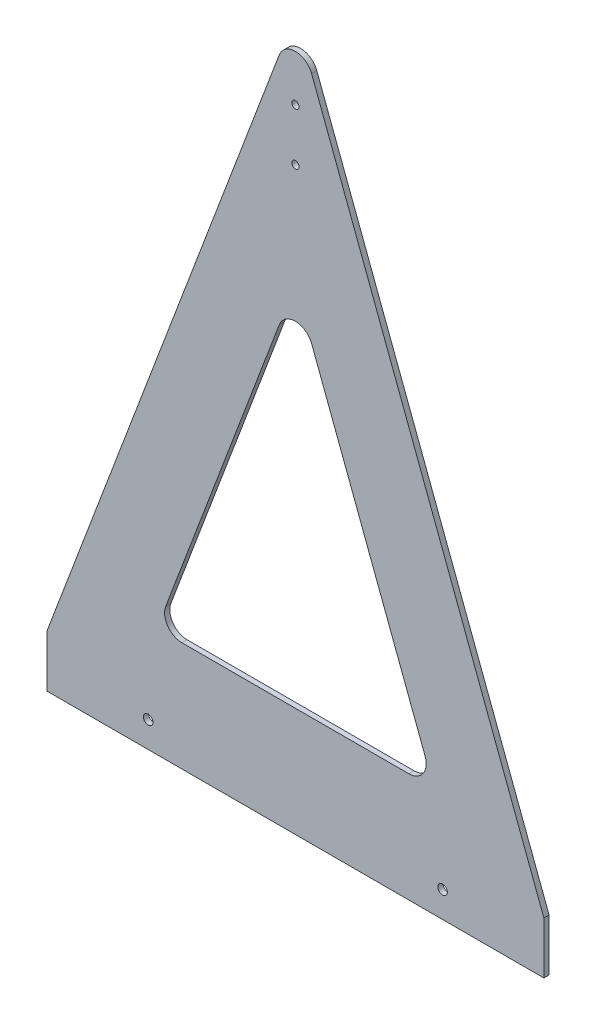
ISO-10303-21;
HEADER;
FILE_DESCRIPTION(('STEP AP214'),'2;1');
FILE_NAME('part.step','',(''),(''),'','','');
FILE_SCHEMA(('AUTOMOTIVE_DESIGN { 1 0 10303 214 1 1 1 1 }'));
ENDSEC;
DATA;
#1=APPLICATION_CONTEXT('core data for automotive mechanical design processes');
#2=APPLICATION_PROTOCOL_DEFINITION('international standard','automotive_design',2000,#1);
#3=PRODUCT_CONTEXT('',#1,'mechanical');
#4=PRODUCT('Part','Part','',(#3));
#5=PRODUCT_RELATED_PRODUCT_CATEGORY('part','',(#4));
#6=PRODUCT_DEFINITION_FORMATION('','',#4);
#7=PRODUCT_DEFINITION_CONTEXT('part definition',#1,'design');
#8=PRODUCT_DEFINITION('design','',#6,#7);
#9=PRODUCT_DEFINITION_SHAPE('','',#8);
#10=(LENGTH_UNIT() NAMED_UNIT(*) SI_UNIT(.MILLI.,.METRE.));
#11=(NAMED_UNIT(*) PLANE_ANGLE_UNIT() SI_UNIT($,.RADIAN.));
#12=(NAMED_UNIT(*) SI_UNIT($,.STERADIAN.) SOLID_ANGLE_UNIT());
#13=UNCERTAINTY_MEASURE_WITH_UNIT(LENGTH_MEASURE(1.E-05),#10,'distance_accuracy_value','');
#14=(GEOMETRIC_REPRESENTATION_CONTEXT(3) GLOBAL_UNCERTAINTY_ASSIGNED_CONTEXT((#13)) GLOBAL_UNIT_ASSIGNED_CONTEXT((#10,
#11,#12)) REPRESENTATION_CONTEXT('',''));
#15=CARTESIAN_POINT('',(0.,0.,0.));
#16=DIRECTION('',(0.,0.,1.));
#17=DIRECTION('',(1.,0.,0.));
#18=AXIS2_PLACEMENT_3D('',#15,#16,#17);
#19=CARTESIAN_POINT('',(0.,381.693910764514,3.));
#20=DIRECTION('',(0.,0.,1.));
#21=DIRECTION('',(1.,0.,0.));
#22=AXIS2_PLACEMENT_3D('',#19,#20,#21);
#23=PLANE('',#22);
#24=CARTESIAN_POINT('',(-65.5344110387045,73.1533101045285,3.));
#25=DIRECTION('',(0.,0.,-1.));
#26=DIRECTION('',(1.,0.,0.));
#27=AXIS2_PLACEMENT_3D('',#24,#25,#26);
#28=CIRCLE('',#27,10.);
#29=CARTESIAN_POINT('',(-65.5344110387045,63.1533101045285,3.));
#30=VERTEX_POINT('',#29);
#31=CARTESIAN_POINT('',(-74.8895840605347,76.686118864088,3.));
#32=VERTEX_POINT('',#31);
#33=EDGE_CURVE('E124',#30,#32,#28,.T.);
#34=ORIENTED_EDGE('',*,*,#33,.T.);
#35=DIRECTION('',(0.353280875955955,0.935517302183018,0.));
#36=VECTOR('',#35,1.);
#37=CARTESIAN_POINT('',(-9.35517302183021,250.226719524072,3.));
#38=LINE('',#37,#36);
#39=CARTESIAN_POINT('',(-9.35517302183022,250.226719524072,3.));
#40=VERTEX_POINT('',#39);
#41=EDGE_CURVE('E133',#32,#40,#38,.T.);
#42=ORIENTED_EDGE('',*,*,#41,.T.);
#43=CARTESIAN_POINT('',(0.,246.693910764513,3.));
#44=DIRECTION('',(0.,0.,-1.));
#45=DIRECTION('',(-1.,0.,0.));
#46=AXIS2_PLACEMENT_3D('',#43,#44,#45);
#47=CIRCLE('',#46,10.);
#48=CARTESIAN_POINT('',(9.35517302183021,250.226719524072,3.));
#49=VERTEX_POINT('',#48);
#50=EDGE_CURVE('E48',#40,#49,#47,.T.);
#51=ORIENTED_EDGE('',*,*,#50,.T.);
#52=DIRECTION('',(0.353280875955955,-0.935517302183018,0.));
#53=VECTOR('',#52,1.);
#54=CARTESIAN_POINT('',(9.35517302183021,250.226719524072,3.));
#55=LINE('',#54,#53);
#56=CARTESIAN_POINT('',(74.8895840605347,76.686118864088,3.));
#57=VERTEX_POINT('',#56);
#58=EDGE_CURVE('E147',#49,#57,#55,.T.);
#59=ORIENTED_EDGE('',*,*,#58,.T.);
#60=CARTESIAN_POINT('',(65.5344110387045,73.1533101045285,3.));
#61=DIRECTION('',(0.,0.,-1.));
#62=DIRECTION('',(-1.,0.,0.));
#63=AXIS2_PLACEMENT_3D('',#60,#61,#62);
#64=CIRCLE('',#63,10.);
#65=CARTESIAN_POINT('',(65.5344110387045,63.1533101045285,3.));
#66=VERTEX_POINT('',#65);
#67=EDGE_CURVE('E150',#57,#66,#64,.T.);
#68=ORIENTED_EDGE('',*,*,#67,.T.);
#69=DIRECTION('',(-1.,0.,0.));
#70=VECTOR('',#69,1.);
#71=CARTESIAN_POINT('',(-65.5344110387045,63.1533101045285,3.));
#72=LINE('',#71,#70);
#73=EDGE_CURVE('E130',#66,#30,#72,.T.);
#74=ORIENTED_EDGE('',*,*,#73,.T.);
#75=EDGE_LOOP('',(#34,#42,#51,#59,#68,#74));
#76=FACE_BOUND('',#75,.T.);
#77=CARTESIAN_POINT('',(85.,15.,3.));
#78=DIRECTION('',(0.,0.,-1.));
#79=DIRECTION('',(-1.,0.,0.));
#80=AXIS2_PLACEMENT_3D('',#77,#78,#79);
#81=CIRCLE('',#80,2.75);
#82=CARTESIAN_POINT('',(82.25,15.,3.));
#83=VERTEX_POINT('',#82);
#84=EDGE_CURVE('E176',#83,#83,#81,.T.);
#85=ORIENTED_EDGE('',*,*,#84,.T.);
#86=EDGE_LOOP('',(#85));
#87=FACE_BOUND('',#86,.T.);
#88=CARTESIAN_POINT('',(-85.,15.,3.));
#89=DIRECTION('',(0.,0.,-1.));
#90=DIRECTION('',(-1.,0.,0.));
#91=AXIS2_PLACEMENT_3D('',#88,#89,#90);
#92=CIRCLE('',#91,2.75);
#93=CARTESIAN_POINT('',(-87.75,15.,3.));
#94=VERTEX_POINT('',#93);
#95=EDGE_CURVE('E182',#94,#94,#92,.T.);
#96=ORIENTED_EDGE('',*,*,#95,.T.);
#97=EDGE_LOOP('',(#96));
#98=FACE_BOUND('',#97,.T.);
#99=CARTESIAN_POINT('',(-1.0548853457415E-11,364.999999999999,3.));
#100=DIRECTION('',(0.,0.,1.));
#101=DIRECTION('',(1.,0.,0.));
#102=AXIS2_PLACEMENT_3D('',#99,#100,#101);
#103=CIRCLE('',#102,2.1);
#104=CARTESIAN_POINT('',(2.09999999998945,364.999999999999,3.));
#105=VERTEX_POINT('',#104);
#106=EDGE_CURVE('E192',#105,#105,#103,.T.);
#107=ORIENTED_EDGE('',*,*,#106,.F.);
#108=EDGE_LOOP('',(#107));
#109=FACE_BOUND('',#108,.T.);
#110=DIRECTION('',(0.,1.,0.));
#111=VECTOR('',#110,1.);
#112=CARTESIAN_POINT('',(143.5,0.,3.));
#113=LINE('',#112,#111);
#114=CARTESIAN_POINT('',(143.5,0.,3.));
#115=VERTEX_POINT('',#114);
#116=CARTESIAN_POINT('',(143.5,30.,3.));
#117=VERTEX_POINT('',#116);
#118=EDGE_CURVE('E198',#115,#117,#113,.T.);
#119=ORIENTED_EDGE('',*,*,#118,.T.);
#120=DIRECTION('',(-0.353280875955956,0.935517302183018,0.));
#121=VECTOR('',#120,1.);
#122=CARTESIAN_POINT('',(143.5,30.,3.));
#123=LINE('',#122,#121);
#124=CARTESIAN_POINT('',(9.35517302183029,385.226719524073,3.));
#125=VERTEX_POINT('',#124);
#126=EDGE_CURVE('E201',#117,#125,#123,.T.);
#127=ORIENTED_EDGE('',*,*,#126,.T.);
#128=CARTESIAN_POINT('',(0.,381.693910764514,3.));
#129=DIRECTION('',(0.,0.,1.));
#130=DIRECTION('',(1.,0.,0.));
#131=AXIS2_PLACEMENT_3D('',#128,#129,#130);
#132=CIRCLE('',#131,10.);
#133=CARTESIAN_POINT('',(-9.35517302183028,385.226719524073,3.));
#134=VERTEX_POINT('',#133);
#135=EDGE_CURVE('E204',#125,#134,#132,.T.);
#136=ORIENTED_EDGE('',*,*,#135,.T.);
#137=DIRECTION('',(-0.353280875955955,-0.935517302183018,0.));
#138=VECTOR('',#137,1.);
#139=CARTESIAN_POINT('',(-143.5,29.9999999999991,3.));
#140=LINE('',#139,#138);
#141=CARTESIAN_POINT('',(-143.5,29.9999999999991,3.));
#142=VERTEX_POINT('',#141);
#143=EDGE_CURVE('E206',#134,#142,#140,.T.);
#144=ORIENTED_EDGE('',*,*,#143,.T.);
#145=DIRECTION('',(0.,-1.,0.));
#146=VECTOR('',#145,1.);
#147=CARTESIAN_POINT('',(-143.5,-8.88178419700125E-13,3.));
#148=LINE('',#147,#146);
#149=CARTESIAN_POINT('',(-143.5,-8.88178419700125E-13,3.));
#150=VERTEX_POINT('',#149);
#151=EDGE_CURVE('E208',#142,#150,#148,.T.);
#152=ORIENTED_EDGE('',*,*,#151,.T.);
#153=DIRECTION('',(1.,0.,0.));
#154=VECTOR('',#153,1.);
#155=CARTESIAN_POINT('',(-143.5,-8.88178419700125E-13,3.));
#156=LINE('',#155,#154);
#157=EDGE_CURVE('E210',#150,#115,#156,.T.);
#158=ORIENTED_EDGE('',*,*,#157,.T.);
#159=EDGE_LOOP('',(#119,#127,#136,#144,#152,#158));
#160=FACE_BOUND('',#159,.T.);
#161=CARTESIAN_POINT('',(-9.42486254559352E-12,335.,3.));
#162=DIRECTION('',(0.,0.,1.));
#163=DIRECTION('',(1.,0.,0.));
#164=AXIS2_PLACEMENT_3D('',#161,#162,#163);
#165=CIRCLE('',#164,2.1);
#166=CARTESIAN_POINT('',(2.09999999999057,335.,3.));
#167=VERTEX_POINT('',#166);
#168=EDGE_CURVE('E186',#167,#167,#165,.T.);
#169=ORIENTED_EDGE('',*,*,#168,.F.);
#170=EDGE_LOOP('',(#169));
#171=FACE_BOUND('',#170,.T.);
#172=ADVANCED_FACE('F33',(#76,#87,#98,#109,#160,#171),#23,.T.);
#173=CARTESIAN_POINT('',(0.,381.693910764514,0.));
#174=DIRECTION('',(0.,0.,1.));
#175=DIRECTION('',(1.,0.,0.));
#176=AXIS2_PLACEMENT_3D('',#173,#174,#175);
#177=PLANE('',#176);
#178=DIRECTION('',(0.353280875955955,0.935517302183018,0.));
#179=VECTOR('',#178,1.);
#180=CARTESIAN_POINT('',(-9.35517302183021,250.226719524072,0.));
#181=LINE('',#180,#179);
#182=CARTESIAN_POINT('',(-74.8895840605347,76.686118864088,0.));
#183=VERTEX_POINT('',#182);
#184=CARTESIAN_POINT('',(-9.35517302183021,250.226719524072,0.));
#185=VERTEX_POINT('',#184);
#186=EDGE_CURVE('E154',#183,#185,#181,.T.);
#187=ORIENTED_EDGE('',*,*,#186,.F.);
#188=CARTESIAN_POINT('',(-65.5344110387045,73.1533101045285,0.));
#189=DIRECTION('',(0.,0.,-1.));
#190=DIRECTION('',(1.,0.,0.));
#191=AXIS2_PLACEMENT_3D('',#188,#189,#190);
#192=CIRCLE('',#191,10.);
#193=CARTESIAN_POINT('',(-65.5344110387045,63.1533101045285,0.));
#194=VERTEX_POINT('',#193);
#195=EDGE_CURVE('E56',#194,#183,#192,.T.);
#196=ORIENTED_EDGE('',*,*,#195,.F.);
#197=DIRECTION('',(-1.,0.,0.));
#198=VECTOR('',#197,1.);
#199=CARTESIAN_POINT('',(-65.5344110387045,63.1533101045285,0.));
#200=LINE('',#199,#198);
#201=CARTESIAN_POINT('',(65.5344110387045,63.1533101045285,0.));
#202=VERTEX_POINT('',#201);
#203=EDGE_CURVE('E140',#202,#194,#200,.T.);
#204=ORIENTED_EDGE('',*,*,#203,.F.);
#205=CARTESIAN_POINT('',(65.5344110387045,73.1533101045285,0.));
#206=DIRECTION('',(0.,0.,-1.));
#207=DIRECTION('',(-1.,0.,0.));
#208=AXIS2_PLACEMENT_3D('',#205,#206,#207);
#209=CIRCLE('',#208,10.);
#210=CARTESIAN_POINT('',(74.8895840605347,76.686118864088,0.));
#211=VERTEX_POINT('',#210);
#212=EDGE_CURVE('E143',#211,#202,#209,.T.);
#213=ORIENTED_EDGE('',*,*,#212,.F.);
#214=DIRECTION('',(0.353280875955955,-0.935517302183018,0.));
#215=VECTOR('',#214,1.);
#216=CARTESIAN_POINT('',(9.35517302183021,250.226719524072,0.));
#217=LINE('',#216,#215);
#218=CARTESIAN_POINT('',(9.35517302183021,250.226719524072,0.));
#219=VERTEX_POINT('',#218);
#220=EDGE_CURVE('E159',#219,#211,#217,.T.);
#221=ORIENTED_EDGE('',*,*,#220,.F.);
#222=CARTESIAN_POINT('',(0.,246.693910764513,0.));
#223=DIRECTION('',(0.,0.,-1.));
#224=DIRECTION('',(-1.,0.,0.));
#225=AXIS2_PLACEMENT_3D('',#222,#223,#224);
#226=CIRCLE('',#225,10.);
#227=EDGE_CURVE('E156',#185,#219,#226,.T.);
#228=ORIENTED_EDGE('',*,*,#227,.F.);
#229=EDGE_LOOP('',(#187,#196,#204,#213,#221,#228));
#230=FACE_BOUND('',#229,.T.);
#231=CARTESIAN_POINT('',(85.,15.,0.));
#232=DIRECTION('',(0.,0.,-1.));
#233=DIRECTION('',(-1.,0.,0.));
#234=AXIS2_PLACEMENT_3D('',#231,#232,#233);
#235=CIRCLE('',#234,2.75);
#236=CARTESIAN_POINT('',(82.25,15.,0.));
#237=VERTEX_POINT('',#236);
#238=EDGE_CURVE('E166',#237,#237,#235,.T.);
#239=ORIENTED_EDGE('',*,*,#238,.F.);
#240=EDGE_LOOP('',(#239));
#241=FACE_BOUND('',#240,.T.);
#242=CARTESIAN_POINT('',(-85.,15.,0.));
#243=DIRECTION('',(0.,0.,-1.));
#244=DIRECTION('',(-1.,0.,0.));
#245=AXIS2_PLACEMENT_3D('',#242,#243,#244);
#246=CIRCLE('',#245,2.75);
#247=CARTESIAN_POINT('',(-87.75,15.,0.));
#248=VERTEX_POINT('',#247);
#249=EDGE_CURVE('E179',#248,#248,#246,.T.);
#250=ORIENTED_EDGE('',*,*,#249,.F.);
#251=EDGE_LOOP('',(#250));
#252=FACE_BOUND('',#251,.T.);
#253=DIRECTION('',(0.,1.,0.));
#254=VECTOR('',#253,1.);
#255=CARTESIAN_POINT('',(143.5,0.,0.));
#256=LINE('',#255,#254);
#257=CARTESIAN_POINT('',(143.5,0.,0.));
#258=VERTEX_POINT('',#257);
#259=CARTESIAN_POINT('',(143.5,30.,0.));
#260=VERTEX_POINT('',#259);
#261=EDGE_CURVE('E195',#258,#260,#256,.T.);
#262=ORIENTED_EDGE('',*,*,#261,.F.);
#263=DIRECTION('',(1.,0.,0.));
#264=VECTOR('',#263,1.);
#265=CARTESIAN_POINT('',(-143.5,-8.88178419700125E-13,0.));
#266=LINE('',#265,#264);
#267=CARTESIAN_POINT('',(-143.5,-8.88178419700125E-13,0.));
#268=VERTEX_POINT('',#267);
#269=EDGE_CURVE('E202',#268,#258,#266,.T.);
#270=ORIENTED_EDGE('',*,*,#269,.F.);
#271=DIRECTION('',(0.,-1.,0.));
#272=VECTOR('',#271,1.);
#273=CARTESIAN_POINT('',(-143.5,-8.88178419700125E-13,0.));
#274=LINE('',#273,#272);
#275=CARTESIAN_POINT('',(-143.5,29.9999999999991,0.));
#276=VERTEX_POINT('',#275);
#277=EDGE_CURVE('E221',#276,#268,#274,.T.);
#278=ORIENTED_EDGE('',*,*,#277,.F.);
#279=DIRECTION('',(-0.353280875955955,-0.935517302183018,0.));
#280=VECTOR('',#279,1.);
#281=CARTESIAN_POINT('',(-143.5,29.9999999999991,0.));
#282=LINE('',#281,#280);
#283=CARTESIAN_POINT('',(-9.35517302183028,385.226719524073,0.));
#284=VERTEX_POINT('',#283);
#285=EDGE_CURVE('E219',#284,#276,#282,.T.);
#286=ORIENTED_EDGE('',*,*,#285,.F.);
#287=CARTESIAN_POINT('',(0.,381.693910764514,0.));
#288=DIRECTION('',(0.,0.,1.));
#289=DIRECTION('',(1.,0.,0.));
#290=AXIS2_PLACEMENT_3D('',#287,#288,#289);
#291=CIRCLE('',#290,10.);
#292=CARTESIAN_POINT('',(9.35517302183029,385.226719524073,0.));
#293=VERTEX_POINT('',#292);
#294=EDGE_CURVE('E217',#293,#284,#291,.T.);
#295=ORIENTED_EDGE('',*,*,#294,.F.);
#296=DIRECTION('',(-0.353280875955956,0.935517302183018,0.));
#297=VECTOR('',#296,1.);
#298=CARTESIAN_POINT('',(143.5,30.,0.));
#299=LINE('',#298,#297);
#300=EDGE_CURVE('E215',#260,#293,#299,.T.);
#301=ORIENTED_EDGE('',*,*,#300,.F.);
#302=EDGE_LOOP('',(#262,#270,#278,#286,#295,#301));
#303=FACE_BOUND('',#302,.T.);
#304=CARTESIAN_POINT('',(-1.0548853457415E-11,364.999999999999,0.));
#305=DIRECTION('',(0.,0.,1.));
#306=DIRECTION('',(1.,0.,0.));
#307=AXIS2_PLACEMENT_3D('',#304,#305,#306);
#308=CIRCLE('',#307,2.1);
#309=CARTESIAN_POINT('',(2.09999999998945,364.999999999999,0.));
#310=VERTEX_POINT('',#309);
#311=EDGE_CURVE('E189',#310,#310,#308,.T.);
#312=ORIENTED_EDGE('',*,*,#311,.T.);
#313=EDGE_LOOP('',(#312));
#314=FACE_BOUND('',#313,.T.);
#315=CARTESIAN_POINT('',(-9.42486254559352E-12,335.,0.));
#316=DIRECTION('',(0.,0.,1.));
#317=DIRECTION('',(1.,0.,0.));
#318=AXIS2_PLACEMENT_3D('',#315,#316,#317);
#319=CIRCLE('',#318,2.1);
#320=CARTESIAN_POINT('',(2.09999999999057,335.,0.));
#321=VERTEX_POINT('',#320);
#322=EDGE_CURVE('E185',#321,#321,#319,.T.);
#323=ORIENTED_EDGE('',*,*,#322,.T.);
#324=EDGE_LOOP('',(#323));
#325=FACE_BOUND('',#324,.T.);
#326=ADVANCED_FACE('F245',(#230,#241,#252,#303,#314,#325),#177,.F.);
#327=CARTESIAN_POINT('',(143.5,0.,3.));
#328=DIRECTION('',(-1.,0.,0.));
#329=DIRECTION('',(0.,0.,1.));
#330=AXIS2_PLACEMENT_3D('',#327,#328,#329);
#331=PLANE('',#330);
#332=ORIENTED_EDGE('',*,*,#261,.T.);
#333=DIRECTION('',(0.,0.,-1.));
#334=VECTOR('',#333,1.);
#335=CARTESIAN_POINT('',(143.5,30.,3.));
#336=LINE('',#335,#334);
#337=EDGE_CURVE('E11',#117,#260,#336,.T.);
#338=ORIENTED_EDGE('',*,*,#337,.F.);
#339=ORIENTED_EDGE('',*,*,#118,.F.);
#340=DIRECTION('',(0.,0.,-1.));
#341=VECTOR('',#340,1.);
#342=CARTESIAN_POINT('',(143.5,0.,3.));
#343=LINE('',#342,#341);
#344=EDGE_CURVE('E212',#115,#258,#343,.T.);
#345=ORIENTED_EDGE('',*,*,#344,.T.);
#346=EDGE_LOOP('',(#332,#338,#339,#345));
#347=FACE_BOUND('',#346,.T.);
#348=ADVANCED_FACE('F35',(#347),#331,.F.);
#349=CARTESIAN_POINT('',(143.5,30.,3.));
#350=DIRECTION('',(-0.935517302183018,-0.353280875955956,0.));
#351=DIRECTION('',(0.353280875955956,-0.935517302183018,0.));
#352=AXIS2_PLACEMENT_3D('',#349,#350,#351);
#353=PLANE('',#352);
#354=ORIENTED_EDGE('',*,*,#300,.T.);
#355=DIRECTION('',(0.,0.,-1.));
#356=VECTOR('',#355,1.);
#357=CARTESIAN_POINT('',(9.35517302183029,385.226719524073,3.));
#358=LINE('',#357,#356);
#359=EDGE_CURVE('E41',#125,#293,#358,.T.);
#360=ORIENTED_EDGE('',*,*,#359,.F.);
#361=ORIENTED_EDGE('',*,*,#126,.F.);
#362=ORIENTED_EDGE('',*,*,#337,.T.);
#363=EDGE_LOOP('',(#354,#360,#361,#362));
#364=FACE_BOUND('',#363,.T.);
#365=ADVANCED_FACE('F263',(#364),#353,.F.);
#366=CARTESIAN_POINT('',(0.,381.693910764514,3.));
#367=DIRECTION('',(0.,0.,-1.));
#368=DIRECTION('',(-1.,0.,0.));
#369=AXIS2_PLACEMENT_3D('',#366,#367,#368);
#370=CYLINDRICAL_SURFACE('',#369,10.);
#371=ORIENTED_EDGE('',*,*,#294,.T.);
#372=DIRECTION('',(0.,0.,-1.));
#373=VECTOR('',#372,1.);
#374=CARTESIAN_POINT('',(-9.35517302183028,385.226719524073,3.));
#375=LINE('',#374,#373);
#376=EDGE_CURVE('E232',#134,#284,#375,.T.);
#377=ORIENTED_EDGE('',*,*,#376,.F.);
#378=ORIENTED_EDGE('',*,*,#135,.F.);
#379=ORIENTED_EDGE('',*,*,#359,.T.);
#380=EDGE_LOOP('',(#371,#377,#378,#379));
#381=FACE_BOUND('',#380,.T.);
#382=ADVANCED_FACE('F239',(#381),#370,.T.);
#383=CARTESIAN_POINT('',(-143.5,29.9999999999991,3.));
#384=DIRECTION('',(0.935517302183018,-0.353280875955955,0.));
#385=DIRECTION('',(0.353280875955955,0.935517302183019,0.));
#386=AXIS2_PLACEMENT_3D('',#383,#384,#385);
#387=PLANE('',#386);
#388=ORIENTED_EDGE('',*,*,#285,.T.);
#389=DIRECTION('',(0.,0.,-1.));
#390=VECTOR('',#389,1.);
#391=CARTESIAN_POINT('',(-143.5,29.9999999999991,3.));
#392=LINE('',#391,#390);
#393=EDGE_CURVE('E229',#142,#276,#392,.T.);
#394=ORIENTED_EDGE('',*,*,#393,.F.);
#395=ORIENTED_EDGE('',*,*,#143,.F.);
#396=ORIENTED_EDGE('',*,*,#376,.T.);
#397=EDGE_LOOP('',(#388,#394,#395,#396));
#398=FACE_BOUND('',#397,.T.);
#399=ADVANCED_FACE('F251',(#398),#387,.F.);
#400=CARTESIAN_POINT('',(-143.5,-8.88178419700125E-13,3.));
#401=DIRECTION('',(1.,0.,0.));
#402=DIRECTION('',(0.,1.,0.));
#403=AXIS2_PLACEMENT_3D('',#400,#401,#402);
#404=PLANE('',#403);
#405=ORIENTED_EDGE('',*,*,#277,.T.);
#406=DIRECTION('',(0.,0.,-1.));
#407=VECTOR('',#406,1.);
#408=CARTESIAN_POINT('',(-143.5,-8.88178419700125E-13,3.));
#409=LINE('',#408,#407);
#410=EDGE_CURVE('E226',#150,#268,#409,.T.);
#411=ORIENTED_EDGE('',*,*,#410,.F.);
#412=ORIENTED_EDGE('',*,*,#151,.F.);
#413=ORIENTED_EDGE('',*,*,#393,.T.);
#414=EDGE_LOOP('',(#405,#411,#412,#413));
#415=FACE_BOUND('',#414,.T.);
#416=ADVANCED_FACE('F255',(#415),#404,.F.);
#417=CARTESIAN_POINT('',(-143.5,-8.88178419700125E-13,3.));
#418=DIRECTION('',(0.,1.,0.));
#419=DIRECTION('',(-1.,0.,0.));
#420=AXIS2_PLACEMENT_3D('',#417,#418,#419);
#421=PLANE('',#420);
#422=ORIENTED_EDGE('',*,*,#269,.T.);
#423=ORIENTED_EDGE('',*,*,#344,.F.);
#424=ORIENTED_EDGE('',*,*,#157,.F.);
#425=ORIENTED_EDGE('',*,*,#410,.T.);
#426=EDGE_LOOP('',(#422,#423,#424,#425));
#427=FACE_BOUND('',#426,.T.);
#428=ADVANCED_FACE('F266',(#427),#421,.F.);
#429=CARTESIAN_POINT('',(-1.0548853457415E-11,364.999999999999,3.));
#430=DIRECTION('',(0.,0.,-1.));
#431=DIRECTION('',(-1.,0.,0.));
#432=AXIS2_PLACEMENT_3D('',#429,#430,#431);
#433=CYLINDRICAL_SURFACE('',#432,2.1);
#434=ORIENTED_EDGE('',*,*,#106,.T.);
#435=EDGE_LOOP('',(#434));
#436=FACE_BOUND('',#435,.T.);
#437=ORIENTED_EDGE('',*,*,#311,.F.);
#438=EDGE_LOOP('',(#437));
#439=FACE_BOUND('',#438,.T.);
#440=ADVANCED_FACE('F268',(#436,#439),#433,.F.);
#441=CARTESIAN_POINT('',(-9.42486254559352E-12,335.,3.));
#442=DIRECTION('',(0.,0.,-1.));
#443=DIRECTION('',(-1.,0.,0.));
#444=AXIS2_PLACEMENT_3D('',#441,#442,#443);
#445=CYLINDRICAL_SURFACE('',#444,2.1);
#446=ORIENTED_EDGE('',*,*,#168,.T.);
#447=EDGE_LOOP('',(#446));
#448=FACE_BOUND('',#447,.T.);
#449=ORIENTED_EDGE('',*,*,#322,.F.);
#450=EDGE_LOOP('',(#449));
#451=FACE_BOUND('',#450,.T.);
#452=ADVANCED_FACE('F274',(#448,#451),#445,.F.);
#453=CARTESIAN_POINT('',(-85.,15.,0.));
#454=DIRECTION('',(0.,0.,-1.));
#455=DIRECTION('',(-1.,0.,0.));
#456=AXIS2_PLACEMENT_3D('',#453,#454,#455);
#457=CYLINDRICAL_SURFACE('',#456,2.75);
#458=ORIENTED_EDGE('',*,*,#95,.F.);
#459=EDGE_LOOP('',(#458));
#460=FACE_BOUND('',#459,.T.);
#461=ORIENTED_EDGE('',*,*,#249,.T.);
#462=EDGE_LOOP('',(#461));
#463=FACE_BOUND('',#462,.T.);
#464=ADVANCED_FACE('F288',(#460,#463),#457,.F.);
#465=CARTESIAN_POINT('',(85.,15.,0.));
#466=DIRECTION('',(0.,0.,-1.));
#467=DIRECTION('',(-1.,0.,0.));
#468=AXIS2_PLACEMENT_3D('',#465,#466,#467);
#469=CYLINDRICAL_SURFACE('',#468,2.75);
#470=ORIENTED_EDGE('',*,*,#84,.F.);
#471=EDGE_LOOP('',(#470));
#472=FACE_BOUND('',#471,.T.);
#473=ORIENTED_EDGE('',*,*,#238,.T.);
#474=EDGE_LOOP('',(#473));
#475=FACE_BOUND('',#474,.T.);
#476=ADVANCED_FACE('F292',(#472,#475),#469,.F.);
#477=CARTESIAN_POINT('',(-65.5344110387045,73.1533101045285,3.));
#478=DIRECTION('',(0.,0.,-1.));
#479=DIRECTION('',(-1.,0.,0.));
#480=AXIS2_PLACEMENT_3D('',#477,#478,#479);
#481=CYLINDRICAL_SURFACE('',#480,10.);
#482=ORIENTED_EDGE('',*,*,#195,.T.);
#483=DIRECTION('',(0.,0.,-1.));
#484=VECTOR('',#483,1.);
#485=CARTESIAN_POINT('',(-74.8895840605347,76.686118864088,3.));
#486=LINE('',#485,#484);
#487=EDGE_CURVE('E120',#32,#183,#486,.T.);
#488=ORIENTED_EDGE('',*,*,#487,.F.);
#489=ORIENTED_EDGE('',*,*,#33,.F.);
#490=DIRECTION('',(0.,0.,-1.));
#491=VECTOR('',#490,1.);
#492=CARTESIAN_POINT('',(-65.5344110387045,63.1533101045285,3.));
#493=LINE('',#492,#491);
#494=EDGE_CURVE('E164',#30,#194,#493,.T.);
#495=ORIENTED_EDGE('',*,*,#494,.T.);
#496=EDGE_LOOP('',(#482,#488,#489,#495));
#497=FACE_BOUND('',#496,.T.);
#498=ADVANCED_FACE('F122',(#497),#481,.F.);
#499=CARTESIAN_POINT('',(-65.5344110387045,63.1533101045285,3.));
#500=DIRECTION('',(0.,-1.,0.));
#501=DIRECTION('',(0.,0.,-1.));
#502=AXIS2_PLACEMENT_3D('',#499,#500,#501);
#503=PLANE('',#502);
#504=ORIENTED_EDGE('',*,*,#203,.T.);
#505=ORIENTED_EDGE('',*,*,#494,.F.);
#506=ORIENTED_EDGE('',*,*,#73,.F.);
#507=DIRECTION('',(0.,0.,-1.));
#508=VECTOR('',#507,1.);
#509=CARTESIAN_POINT('',(65.5344110387045,63.1533101045285,3.));
#510=LINE('',#509,#508);
#511=EDGE_CURVE('E167',#66,#202,#510,.T.);
#512=ORIENTED_EDGE('',*,*,#511,.T.);
#513=EDGE_LOOP('',(#504,#505,#506,#512));
#514=FACE_BOUND('',#513,.T.);
#515=ADVANCED_FACE('F299',(#514),#503,.F.);
#516=CARTESIAN_POINT('',(65.5344110387045,73.1533101045285,3.));
#517=DIRECTION('',(0.,0.,-1.));
#518=DIRECTION('',(-1.,0.,0.));
#519=AXIS2_PLACEMENT_3D('',#516,#517,#518);
#520=CYLINDRICAL_SURFACE('',#519,10.);
#521=ORIENTED_EDGE('',*,*,#212,.T.);
#522=ORIENTED_EDGE('',*,*,#511,.F.);
#523=ORIENTED_EDGE('',*,*,#67,.F.);
#524=DIRECTION('',(0.,0.,-1.));
#525=VECTOR('',#524,1.);
#526=CARTESIAN_POINT('',(74.8895840605347,76.686118864088,3.));
#527=LINE('',#526,#525);
#528=EDGE_CURVE('E169',#57,#211,#527,.T.);
#529=ORIENTED_EDGE('',*,*,#528,.T.);
#530=EDGE_LOOP('',(#521,#522,#523,#529));
#531=FACE_BOUND('',#530,.T.);
#532=ADVANCED_FACE('F308',(#531),#520,.F.);
#533=CARTESIAN_POINT('',(9.35517302183021,250.226719524072,3.));
#534=DIRECTION('',(0.935517302183018,0.353280875955955,0.));
#535=DIRECTION('',(-0.353280875955955,0.935517302183019,0.));
#536=AXIS2_PLACEMENT_3D('',#533,#534,#535);
#537=PLANE('',#536);
#538=ORIENTED_EDGE('',*,*,#220,.T.);
#539=ORIENTED_EDGE('',*,*,#528,.F.);
#540=ORIENTED_EDGE('',*,*,#58,.F.);
#541=DIRECTION('',(0.,0.,-1.));
#542=VECTOR('',#541,1.);
#543=CARTESIAN_POINT('',(9.35517302183021,250.226719524072,3.));
#544=LINE('',#543,#542);
#545=EDGE_CURVE('E171',#49,#219,#544,.T.);
#546=ORIENTED_EDGE('',*,*,#545,.T.);
#547=EDGE_LOOP('',(#538,#539,#540,#546));
#548=FACE_BOUND('',#547,.T.);
#549=ADVANCED_FACE('F305',(#548),#537,.F.);
#550=CARTESIAN_POINT('',(0.,246.693910764513,3.));
#551=DIRECTION('',(0.,0.,-1.));
#552=DIRECTION('',(-1.,0.,0.));
#553=AXIS2_PLACEMENT_3D('',#550,#551,#552);
#554=CYLINDRICAL_SURFACE('',#553,10.);
#555=ORIENTED_EDGE('',*,*,#227,.T.);
#556=ORIENTED_EDGE('',*,*,#545,.F.);
#557=ORIENTED_EDGE('',*,*,#50,.F.);
#558=DIRECTION('',(0.,0.,-1.));
#559=VECTOR('',#558,1.);
#560=CARTESIAN_POINT('',(-9.35517302183021,250.226719524072,3.));
#561=LINE('',#560,#559);
#562=EDGE_CURVE('E129',#40,#185,#561,.T.);
#563=ORIENTED_EDGE('',*,*,#562,.T.);
#564=EDGE_LOOP('',(#555,#556,#557,#563));
#565=FACE_BOUND('',#564,.T.);
#566=ADVANCED_FACE('F302',(#565),#554,.F.);
#567=CARTESIAN_POINT('',(-9.35517302183021,250.226719524072,3.));
#568=DIRECTION('',(-0.935517302183018,0.353280875955955,0.));
#569=DIRECTION('',(-0.353280875955955,-0.935517302183019,0.));
#570=AXIS2_PLACEMENT_3D('',#567,#568,#569);
#571=PLANE('',#570);
#572=ORIENTED_EDGE('',*,*,#186,.T.);
#573=ORIENTED_EDGE('',*,*,#562,.F.);
#574=ORIENTED_EDGE('',*,*,#41,.F.);
#575=ORIENTED_EDGE('',*,*,#487,.T.);
#576=EDGE_LOOP('',(#572,#573,#574,#575));
#577=FACE_BOUND('',#576,.T.);
#578=ADVANCED_FACE('F134',(#577),#571,.F.);
#579=CLOSED_SHELL('',(#172,#326,#348,#365,#382,#399,#416,#428,#440,#452,#464,#476,#498,#515,
#532,#549,#566,#578));
#580=MANIFOLD_SOLID_BREP('B2',#579);
#581=ADVANCED_BREP_SHAPE_REPRESENTATION('',(#18,#580),#14);
#582=SHAPE_DEFINITION_REPRESENTATION(#9,#581);
ENDSEC;
END-ISO-10303-21;
